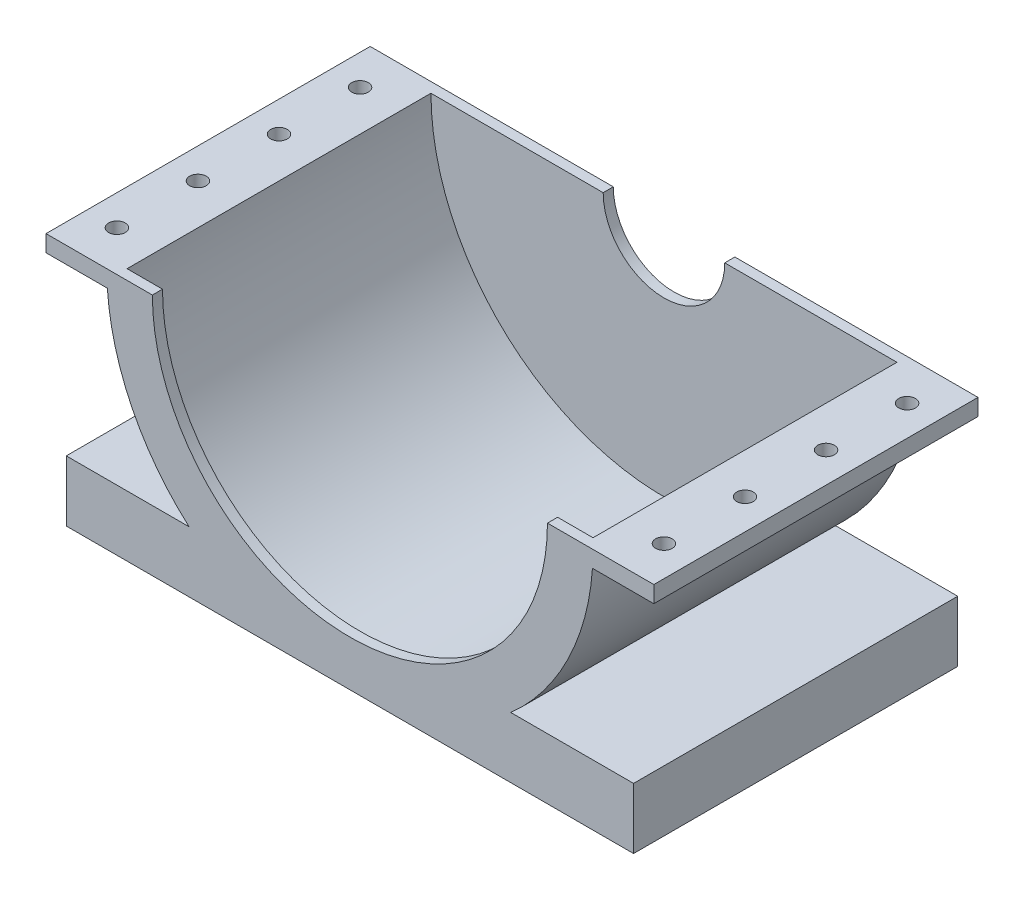
ISO-10303-21;
HEADER;
FILE_DESCRIPTION(('STEP AP214'),'2;1');
FILE_NAME('part.step','',(''),(''),'','','');
FILE_SCHEMA(('AUTOMOTIVE_DESIGN { 1 0 10303 214 1 1 1 1 }'));
ENDSEC;
DATA;
#1=APPLICATION_CONTEXT('core data for automotive mechanical design processes');
#2=APPLICATION_PROTOCOL_DEFINITION('international standard','automotive_design',2000,#1);
#3=PRODUCT_CONTEXT('',#1,'mechanical');
#4=PRODUCT('Part','Part','',(#3));
#5=PRODUCT_RELATED_PRODUCT_CATEGORY('part','',(#4));
#6=PRODUCT_DEFINITION_FORMATION('','',#4);
#7=PRODUCT_DEFINITION_CONTEXT('part definition',#1,'design');
#8=PRODUCT_DEFINITION('design','',#6,#7);
#9=PRODUCT_DEFINITION_SHAPE('','',#8);
#10=(LENGTH_UNIT() NAMED_UNIT(*) SI_UNIT(.MILLI.,.METRE.));
#11=(NAMED_UNIT(*) PLANE_ANGLE_UNIT() SI_UNIT($,.RADIAN.));
#12=(NAMED_UNIT(*) SI_UNIT($,.STERADIAN.) SOLID_ANGLE_UNIT());
#13=UNCERTAINTY_MEASURE_WITH_UNIT(LENGTH_MEASURE(1.E-05),#10,'distance_accuracy_value','');
#14=(GEOMETRIC_REPRESENTATION_CONTEXT(3) GLOBAL_UNCERTAINTY_ASSIGNED_CONTEXT((#13)) GLOBAL_UNIT_ASSIGNED_CONTEXT((#10,
#11,#12)) REPRESENTATION_CONTEXT('',''));
#15=CARTESIAN_POINT('',(0.,0.,0.));
#16=DIRECTION('',(0.,0.,1.));
#17=DIRECTION('',(1.,0.,0.));
#18=AXIS2_PLACEMENT_3D('',#15,#16,#17);
#19=CARTESIAN_POINT('',(0.,60.,80.));
#20=DIRECTION('',(0.,0.,-1.));
#21=DIRECTION('',(-1.,0.,0.));
#22=AXIS2_PLACEMENT_3D('',#19,#20,#21);
#23=CYLINDRICAL_SURFACE('',#22,48.75);
#24=DIRECTION('',(0.,0.,-1.));
#25=VECTOR('',#24,1.);
#26=CARTESIAN_POINT('',(48.75,60.,80.));
#27=LINE('',#26,#25);
#28=CARTESIAN_POINT('',(48.75,60.,80.));
#29=VERTEX_POINT('',#28);
#30=CARTESIAN_POINT('',(48.75,60.,77.5));
#31=VERTEX_POINT('',#30);
#32=EDGE_CURVE('E203',#29,#31,#27,.T.);
#33=ORIENTED_EDGE('',*,*,#32,.T.);
#34=CARTESIAN_POINT('',(0.,60.,77.5));
#35=DIRECTION('',(0.,0.,-1.));
#36=DIRECTION('',(-1.,0.,0.));
#37=AXIS2_PLACEMENT_3D('',#34,#35,#36);
#38=CIRCLE('',#37,48.75);
#39=CARTESIAN_POINT('',(-48.75,60.,77.5));
#40=VERTEX_POINT('',#39);
#41=EDGE_CURVE('E260',#31,#40,#38,.T.);
#42=ORIENTED_EDGE('',*,*,#41,.T.);
#43=DIRECTION('',(0.,0.,-1.));
#44=VECTOR('',#43,1.);
#45=CARTESIAN_POINT('',(-48.75,60.,80.));
#46=LINE('',#45,#44);
#47=CARTESIAN_POINT('',(-48.75,60.,80.));
#48=VERTEX_POINT('',#47);
#49=EDGE_CURVE('E200',#48,#40,#46,.T.);
#50=ORIENTED_EDGE('',*,*,#49,.F.);
#51=CARTESIAN_POINT('',(0.,60.,80.));
#52=DIRECTION('',(0.,0.,-1.));
#53=DIRECTION('',(1.,0.,0.));
#54=AXIS2_PLACEMENT_3D('',#51,#52,#53);
#55=CIRCLE('',#54,48.75);
#56=EDGE_CURVE('E297',#29,#48,#55,.T.);
#57=ORIENTED_EDGE('',*,*,#56,.F.);
#58=EDGE_LOOP('',(#33,#42,#50,#57));
#59=FACE_BOUND('',#58,.T.);
#60=ADVANCED_FACE('F35',(#59),#23,.F.);
#61=CARTESIAN_POINT('',(-70.,0.,80.));
#62=DIRECTION('',(1.,0.,0.));
#63=DIRECTION('',(0.,0.,-1.));
#64=AXIS2_PLACEMENT_3D('',#61,#62,#63);
#65=PLANE('',#64);
#66=DIRECTION('',(0.,-1.,0.));
#67=VECTOR('',#66,1.);
#68=CARTESIAN_POINT('',(-70.,0.,0.));
#69=LINE('',#68,#67);
#70=CARTESIAN_POINT('',(-70.,15.,0.));
#71=VERTEX_POINT('',#70);
#72=CARTESIAN_POINT('',(-70.,0.,0.));
#73=VERTEX_POINT('',#72);
#74=EDGE_CURVE('E167',#71,#73,#69,.T.);
#75=ORIENTED_EDGE('',*,*,#74,.T.);
#76=DIRECTION('',(0.,0.,-1.));
#77=VECTOR('',#76,1.);
#78=CARTESIAN_POINT('',(-70.,0.,80.));
#79=LINE('',#78,#77);
#80=CARTESIAN_POINT('',(-70.,0.,80.));
#81=VERTEX_POINT('',#80);
#82=EDGE_CURVE('E224',#81,#73,#79,.T.);
#83=ORIENTED_EDGE('',*,*,#82,.F.);
#84=DIRECTION('',(0.,-1.,0.));
#85=VECTOR('',#84,1.);
#86=CARTESIAN_POINT('',(-70.,0.,80.));
#87=LINE('',#86,#85);
#88=CARTESIAN_POINT('',(-70.,15.,80.));
#89=VERTEX_POINT('',#88);
#90=EDGE_CURVE('E193',#89,#81,#87,.T.);
#91=ORIENTED_EDGE('',*,*,#90,.F.);
#92=DIRECTION('',(0.,0.,-1.));
#93=VECTOR('',#92,1.);
#94=CARTESIAN_POINT('',(-70.,15.,80.));
#95=LINE('',#94,#93);
#96=EDGE_CURVE('E163',#89,#71,#95,.T.);
#97=ORIENTED_EDGE('',*,*,#96,.T.);
#98=EDGE_LOOP('',(#75,#83,#91,#97));
#99=FACE_BOUND('',#98,.T.);
#100=ADVANCED_FACE('F37',(#99),#65,.F.);
#101=CARTESIAN_POINT('',(-70.,0.,80.));
#102=DIRECTION('',(0.,1.,0.));
#103=DIRECTION('',(0.,0.,1.));
#104=AXIS2_PLACEMENT_3D('',#101,#102,#103);
#105=PLANE('',#104);
#106=DIRECTION('',(1.,0.,0.));
#107=VECTOR('',#106,1.);
#108=CARTESIAN_POINT('',(-70.,0.,0.));
#109=LINE('',#108,#107);
#110=CARTESIAN_POINT('',(70.,0.,0.));
#111=VERTEX_POINT('',#110);
#112=EDGE_CURVE('E170',#73,#111,#109,.T.);
#113=ORIENTED_EDGE('',*,*,#112,.T.);
#114=DIRECTION('',(0.,0.,-1.));
#115=VECTOR('',#114,1.);
#116=CARTESIAN_POINT('',(70.,0.,80.));
#117=LINE('',#116,#115);
#118=CARTESIAN_POINT('',(70.,0.,80.));
#119=VERTEX_POINT('',#118);
#120=EDGE_CURVE('E221',#119,#111,#117,.T.);
#121=ORIENTED_EDGE('',*,*,#120,.F.);
#122=DIRECTION('',(1.,0.,0.));
#123=VECTOR('',#122,1.);
#124=CARTESIAN_POINT('',(-70.,0.,80.));
#125=LINE('',#124,#123);
#126=EDGE_CURVE('E109',#81,#119,#125,.T.);
#127=ORIENTED_EDGE('',*,*,#126,.F.);
#128=ORIENTED_EDGE('',*,*,#82,.T.);
#129=EDGE_LOOP('',(#113,#121,#127,#128));
#130=FACE_BOUND('',#129,.T.);
#131=ADVANCED_FACE('F331',(#130),#105,.F.);
#132=CARTESIAN_POINT('',(70.,0.,80.));
#133=DIRECTION('',(-1.,0.,0.));
#134=DIRECTION('',(0.,0.,1.));
#135=AXIS2_PLACEMENT_3D('',#132,#133,#134);
#136=PLANE('',#135);
#137=DIRECTION('',(0.,1.,0.));
#138=VECTOR('',#137,1.);
#139=CARTESIAN_POINT('',(70.,0.,0.));
#140=LINE('',#139,#138);
#141=CARTESIAN_POINT('',(70.,15.,0.));
#142=VERTEX_POINT('',#141);
#143=EDGE_CURVE('E173',#111,#142,#140,.T.);
#144=ORIENTED_EDGE('',*,*,#143,.T.);
#145=DIRECTION('',(0.,0.,-1.));
#146=VECTOR('',#145,1.);
#147=CARTESIAN_POINT('',(70.,15.,80.));
#148=LINE('',#147,#146);
#149=CARTESIAN_POINT('',(70.,15.,80.));
#150=VERTEX_POINT('',#149);
#151=EDGE_CURVE('E218',#150,#142,#148,.T.);
#152=ORIENTED_EDGE('',*,*,#151,.F.);
#153=DIRECTION('',(0.,1.,0.));
#154=VECTOR('',#153,1.);
#155=CARTESIAN_POINT('',(70.,0.,80.));
#156=LINE('',#155,#154);
#157=EDGE_CURVE('E285',#119,#150,#156,.T.);
#158=ORIENTED_EDGE('',*,*,#157,.F.);
#159=ORIENTED_EDGE('',*,*,#120,.T.);
#160=EDGE_LOOP('',(#144,#152,#158,#159));
#161=FACE_BOUND('',#160,.T.);
#162=ADVANCED_FACE('F354',(#161),#136,.F.);
#163=CARTESIAN_POINT('',(39.6862696659689,15.,80.));
#164=DIRECTION('',(0.,-1.,0.));
#165=DIRECTION('',(0.,0.,-1.));
#166=AXIS2_PLACEMENT_3D('',#163,#164,#165);
#167=PLANE('',#166);
#168=DIRECTION('',(-1.,0.,0.));
#169=VECTOR('',#168,1.);
#170=CARTESIAN_POINT('',(39.6862696659689,15.,0.));
#171=LINE('',#170,#169);
#172=CARTESIAN_POINT('',(39.6862696659689,15.,0.));
#173=VERTEX_POINT('',#172);
#174=EDGE_CURVE('E175',#142,#173,#171,.T.);
#175=ORIENTED_EDGE('',*,*,#174,.T.);
#176=DIRECTION('',(0.,0.,-1.));
#177=VECTOR('',#176,1.);
#178=CARTESIAN_POINT('',(39.6862696659689,15.,80.));
#179=LINE('',#178,#177);
#180=CARTESIAN_POINT('',(39.6862696659689,15.,80.));
#181=VERTEX_POINT('',#180);
#182=EDGE_CURVE('E215',#181,#173,#179,.T.);
#183=ORIENTED_EDGE('',*,*,#182,.F.);
#184=DIRECTION('',(-1.,0.,0.));
#185=VECTOR('',#184,1.);
#186=CARTESIAN_POINT('',(39.6862696659689,15.,80.));
#187=LINE('',#186,#185);
#188=EDGE_CURVE('E287',#150,#181,#187,.T.);
#189=ORIENTED_EDGE('',*,*,#188,.F.);
#190=ORIENTED_EDGE('',*,*,#151,.T.);
#191=EDGE_LOOP('',(#175,#183,#189,#190));
#192=FACE_BOUND('',#191,.T.);
#193=ADVANCED_FACE('F350',(#192),#167,.F.);
#194=CARTESIAN_POINT('',(0.,60.,80.));
#195=DIRECTION('',(0.,0.,-1.));
#196=DIRECTION('',(-1.,0.,0.));
#197=AXIS2_PLACEMENT_3D('',#194,#195,#196);
#198=CYLINDRICAL_SURFACE('',#197,60.);
#199=CARTESIAN_POINT('',(0.,60.,0.));
#200=DIRECTION('',(0.,0.,1.));
#201=DIRECTION('',(1.,0.,0.));
#202=AXIS2_PLACEMENT_3D('',#199,#200,#201);
#203=CIRCLE('',#202,60.);
#204=CARTESIAN_POINT('',(59.8597527559211,55.9,0.));
#205=VERTEX_POINT('',#204);
#206=EDGE_CURVE('E177',#173,#205,#203,.T.);
#207=ORIENTED_EDGE('',*,*,#206,.T.);
#208=DIRECTION('',(0.,0.,-1.));
#209=VECTOR('',#208,1.);
#210=CARTESIAN_POINT('',(59.8597527559211,55.9,80.));
#211=LINE('',#210,#209);
#212=CARTESIAN_POINT('',(59.8597527559211,55.9,80.));
#213=VERTEX_POINT('',#212);
#214=EDGE_CURVE('E212',#213,#205,#211,.T.);
#215=ORIENTED_EDGE('',*,*,#214,.F.);
#216=CARTESIAN_POINT('',(0.,60.,80.));
#217=DIRECTION('',(0.,0.,1.));
#218=DIRECTION('',(1.,0.,0.));
#219=AXIS2_PLACEMENT_3D('',#216,#217,#218);
#220=CIRCLE('',#219,60.);
#221=EDGE_CURVE('E289',#181,#213,#220,.T.);
#222=ORIENTED_EDGE('',*,*,#221,.F.);
#223=ORIENTED_EDGE('',*,*,#182,.T.);
#224=EDGE_LOOP('',(#207,#215,#222,#223));
#225=FACE_BOUND('',#224,.T.);
#226=ADVANCED_FACE('F346',(#225),#198,.T.);
#227=CARTESIAN_POINT('',(75.,55.9,80.));
#228=DIRECTION('',(0.,1.,0.));
#229=DIRECTION('',(-1.,0.,0.));
#230=AXIS2_PLACEMENT_3D('',#227,#228,#229);
#231=PLANE('',#230);
#232=CARTESIAN_POINT('',(67.5,55.8999999999999,50.));
#233=DIRECTION('',(0.,1.,0.));
#234=DIRECTION('',(-1.,0.,0.));
#235=AXIS2_PLACEMENT_3D('',#232,#233,#234);
#236=CIRCLE('',#235,2.04999999999999);
#237=CARTESIAN_POINT('',(65.45,55.8999999999999,50.));
#238=VERTEX_POINT('',#237);
#239=EDGE_CURVE('E561',#238,#238,#236,.F.);
#240=ORIENTED_EDGE('',*,*,#239,.F.);
#241=EDGE_LOOP('',(#240));
#242=FACE_BOUND('',#241,.T.);
#243=CARTESIAN_POINT('',(67.5,55.8999999999999,30.));
#244=DIRECTION('',(0.,1.,0.));
#245=DIRECTION('',(-1.,0.,0.));
#246=AXIS2_PLACEMENT_3D('',#243,#244,#245);
#247=CIRCLE('',#246,2.04999999999999);
#248=CARTESIAN_POINT('',(65.45,55.8999999999999,30.));
#249=VERTEX_POINT('',#248);
#250=EDGE_CURVE('E565',#249,#249,#247,.F.);
#251=ORIENTED_EDGE('',*,*,#250,.F.);
#252=EDGE_LOOP('',(#251));
#253=FACE_BOUND('',#252,.T.);
#254=CARTESIAN_POINT('',(67.5,55.8999999999999,10.));
#255=DIRECTION('',(0.,1.,0.));
#256=DIRECTION('',(-1.,0.,0.));
#257=AXIS2_PLACEMENT_3D('',#254,#255,#256);
#258=CIRCLE('',#257,2.04999999999999);
#259=CARTESIAN_POINT('',(65.45,55.8999999999999,10.));
#260=VERTEX_POINT('',#259);
#261=EDGE_CURVE('E577',#260,#260,#258,.F.);
#262=ORIENTED_EDGE('',*,*,#261,.F.);
#263=EDGE_LOOP('',(#262));
#264=FACE_BOUND('',#263,.T.);
#265=CARTESIAN_POINT('',(67.5,55.8999999999999,70.));
#266=DIRECTION('',(0.,1.,0.));
#267=DIRECTION('',(-1.,0.,0.));
#268=AXIS2_PLACEMENT_3D('',#265,#266,#267);
#269=CIRCLE('',#268,2.04999999999999);
#270=CARTESIAN_POINT('',(65.45,55.8999999999999,70.));
#271=VERTEX_POINT('',#270);
#272=EDGE_CURVE('E264',#271,#271,#269,.F.);
#273=ORIENTED_EDGE('',*,*,#272,.F.);
#274=EDGE_LOOP('',(#273));
#275=FACE_BOUND('',#274,.T.);
#276=DIRECTION('',(1.,0.,0.));
#277=VECTOR('',#276,1.);
#278=CARTESIAN_POINT('',(75.,55.9,0.));
#279=LINE('',#278,#277);
#280=CARTESIAN_POINT('',(75.,55.9,0.));
#281=VERTEX_POINT('',#280);
#282=EDGE_CURVE('E179',#205,#281,#279,.T.);
#283=ORIENTED_EDGE('',*,*,#282,.T.);
#284=DIRECTION('',(0.,0.,-1.));
#285=VECTOR('',#284,1.);
#286=CARTESIAN_POINT('',(75.,55.9,80.));
#287=LINE('',#286,#285);
#288=CARTESIAN_POINT('',(75.,55.9,80.));
#289=VERTEX_POINT('',#288);
#290=EDGE_CURVE('E209',#289,#281,#287,.T.);
#291=ORIENTED_EDGE('',*,*,#290,.F.);
#292=DIRECTION('',(1.,0.,0.));
#293=VECTOR('',#292,1.);
#294=CARTESIAN_POINT('',(75.,55.9,80.));
#295=LINE('',#294,#293);
#296=EDGE_CURVE('E291',#213,#289,#295,.T.);
#297=ORIENTED_EDGE('',*,*,#296,.F.);
#298=ORIENTED_EDGE('',*,*,#214,.T.);
#299=EDGE_LOOP('',(#283,#291,#297,#298));
#300=FACE_BOUND('',#299,.T.);
#301=ADVANCED_FACE('F342',(#242,#253,#264,#275,#300),#231,.F.);
#302=CARTESIAN_POINT('',(75.,60.,80.));
#303=DIRECTION('',(-1.,0.,0.));
#304=DIRECTION('',(0.,0.,1.));
#305=AXIS2_PLACEMENT_3D('',#302,#303,#304);
#306=PLANE('',#305);
#307=DIRECTION('',(0.,1.,0.));
#308=VECTOR('',#307,1.);
#309=CARTESIAN_POINT('',(75.,60.,0.));
#310=LINE('',#309,#308);
#311=CARTESIAN_POINT('',(75.,60.,0.));
#312=VERTEX_POINT('',#311);
#313=EDGE_CURVE('E181',#281,#312,#310,.T.);
#314=ORIENTED_EDGE('',*,*,#313,.T.);
#315=DIRECTION('',(0.,0.,-1.));
#316=VECTOR('',#315,1.);
#317=CARTESIAN_POINT('',(75.,60.,80.));
#318=LINE('',#317,#316);
#319=CARTESIAN_POINT('',(75.,60.,80.));
#320=VERTEX_POINT('',#319);
#321=EDGE_CURVE('E206',#320,#312,#318,.T.);
#322=ORIENTED_EDGE('',*,*,#321,.F.);
#323=DIRECTION('',(0.,1.,0.));
#324=VECTOR('',#323,1.);
#325=CARTESIAN_POINT('',(75.,60.,80.));
#326=LINE('',#325,#324);
#327=EDGE_CURVE('E293',#289,#320,#326,.T.);
#328=ORIENTED_EDGE('',*,*,#327,.F.);
#329=ORIENTED_EDGE('',*,*,#290,.T.);
#330=EDGE_LOOP('',(#314,#322,#328,#329));
#331=FACE_BOUND('',#330,.T.);
#332=ADVANCED_FACE('F338',(#331),#306,.F.);
#333=CARTESIAN_POINT('',(48.75,60.,80.));
#334=DIRECTION('',(0.,-1.,0.));
#335=DIRECTION('',(0.,0.,-1.));
#336=AXIS2_PLACEMENT_3D('',#333,#334,#335);
#337=PLANE('',#336);
#338=CARTESIAN_POINT('',(67.5,60.,50.));
#339=DIRECTION('',(0.,1.,0.));
#340=DIRECTION('',(0.,0.,1.));
#341=AXIS2_PLACEMENT_3D('',#338,#339,#340);
#342=CIRCLE('',#341,2.04999999999999);
#343=CARTESIAN_POINT('',(67.5,60.,52.05));
#344=VERTEX_POINT('',#343);
#345=EDGE_CURVE('E564',#344,#344,#342,.T.);
#346=ORIENTED_EDGE('',*,*,#345,.F.);
#347=EDGE_LOOP('',(#346));
#348=FACE_BOUND('',#347,.T.);
#349=CARTESIAN_POINT('',(67.5,60.,30.));
#350=DIRECTION('',(0.,1.,0.));
#351=DIRECTION('',(0.,0.,1.));
#352=AXIS2_PLACEMENT_3D('',#349,#350,#351);
#353=CIRCLE('',#352,2.04999999999999);
#354=CARTESIAN_POINT('',(67.5,60.,32.05));
#355=VERTEX_POINT('',#354);
#356=EDGE_CURVE('E570',#355,#355,#353,.T.);
#357=ORIENTED_EDGE('',*,*,#356,.F.);
#358=EDGE_LOOP('',(#357));
#359=FACE_BOUND('',#358,.T.);
#360=CARTESIAN_POINT('',(67.5,60.,10.));
#361=DIRECTION('',(0.,1.,0.));
#362=DIRECTION('',(0.,0.,1.));
#363=AXIS2_PLACEMENT_3D('',#360,#361,#362);
#364=CIRCLE('',#363,2.04999999999999);
#365=CARTESIAN_POINT('',(67.5,60.,12.05));
#366=VERTEX_POINT('',#365);
#367=EDGE_CURVE('E579',#366,#366,#364,.T.);
#368=ORIENTED_EDGE('',*,*,#367,.F.);
#369=EDGE_LOOP('',(#368));
#370=FACE_BOUND('',#369,.T.);
#371=CARTESIAN_POINT('',(67.5,60.,70.));
#372=DIRECTION('',(0.,1.,0.));
#373=DIRECTION('',(0.,0.,1.));
#374=AXIS2_PLACEMENT_3D('',#371,#372,#373);
#375=CIRCLE('',#374,2.04999999999999);
#376=CARTESIAN_POINT('',(67.5,60.,72.05));
#377=VERTEX_POINT('',#376);
#378=EDGE_CURVE('E567',#377,#377,#375,.T.);
#379=ORIENTED_EDGE('',*,*,#378,.F.);
#380=EDGE_LOOP('',(#379));
#381=FACE_BOUND('',#380,.T.);
#382=DIRECTION('',(0.,0.,-1.));
#383=VECTOR('',#382,1.);
#384=CARTESIAN_POINT('',(57.5,60.,0.));
#385=LINE('',#384,#383);
#386=CARTESIAN_POINT('',(57.5,60.,2.5));
#387=VERTEX_POINT('',#386);
#388=CARTESIAN_POINT('',(57.5,60.,77.5));
#389=VERTEX_POINT('',#388);
#390=EDGE_CURVE('E262',#387,#389,#385,.F.);
#391=ORIENTED_EDGE('',*,*,#390,.T.);
#392=DIRECTION('',(-1.,0.,0.));
#393=VECTOR('',#392,1.);
#394=CARTESIAN_POINT('',(48.75,60.,77.5));
#395=LINE('',#394,#393);
#396=EDGE_CURVE('E259',#389,#31,#395,.T.);
#397=ORIENTED_EDGE('',*,*,#396,.T.);
#398=ORIENTED_EDGE('',*,*,#32,.F.);
#399=DIRECTION('',(-1.,0.,0.));
#400=VECTOR('',#399,1.);
#401=CARTESIAN_POINT('',(48.75,60.,80.));
#402=LINE('',#401,#400);
#403=EDGE_CURVE('E295',#320,#29,#402,.T.);
#404=ORIENTED_EDGE('',*,*,#403,.F.);
#405=ORIENTED_EDGE('',*,*,#321,.T.);
#406=DIRECTION('',(-1.,0.,0.));
#407=VECTOR('',#406,1.);
#408=CARTESIAN_POINT('',(48.75,60.,0.));
#409=LINE('',#408,#407);
#410=CARTESIAN_POINT('',(15.,60.,0.));
#411=VERTEX_POINT('',#410);
#412=EDGE_CURVE('E183',#312,#411,#409,.T.);
#413=ORIENTED_EDGE('',*,*,#412,.T.);
#414=DIRECTION('',(0.,0.,-1.));
#415=VECTOR('',#414,1.);
#416=CARTESIAN_POINT('',(15.,60.,2.5));
#417=LINE('',#416,#415);
#418=CARTESIAN_POINT('',(15.,60.,2.5));
#419=VERTEX_POINT('',#418);
#420=EDGE_CURVE('E277',#419,#411,#417,.T.);
#421=ORIENTED_EDGE('',*,*,#420,.F.);
#422=DIRECTION('',(-1.,0.,0.));
#423=VECTOR('',#422,1.);
#424=CARTESIAN_POINT('',(0.,60.,2.5));
#425=LINE('',#424,#423);
#426=EDGE_CURVE('E273',#387,#419,#425,.T.);
#427=ORIENTED_EDGE('',*,*,#426,.F.);
#428=EDGE_LOOP('',(#391,#397,#398,#404,#405,#413,#421,#427));
#429=FACE_BOUND('',#428,.T.);
#430=ADVANCED_FACE('F335',(#348,#359,#370,#381,#429),#337,.F.);
#431=CARTESIAN_POINT('',(-75.,60.,80.));
#432=DIRECTION('',(0.,-1.,0.));
#433=DIRECTION('',(0.,0.,-1.));
#434=AXIS2_PLACEMENT_3D('',#431,#432,#433);
#435=PLANE('',#434);
#436=CARTESIAN_POINT('',(-67.5,60.,10.));
#437=DIRECTION('',(0.,1.,0.));
#438=DIRECTION('',(0.,0.,-1.));
#439=AXIS2_PLACEMENT_3D('',#436,#437,#438);
#440=CIRCLE('',#439,2.04999999999999);
#441=CARTESIAN_POINT('',(-67.5,60.,7.95000000000002));
#442=VERTEX_POINT('',#441);
#443=EDGE_CURVE('E585',#442,#442,#440,.T.);
#444=ORIENTED_EDGE('',*,*,#443,.F.);
#445=EDGE_LOOP('',(#444));
#446=FACE_BOUND('',#445,.T.);
#447=CARTESIAN_POINT('',(-67.5,60.,30.));
#448=DIRECTION('',(0.,1.,0.));
#449=DIRECTION('',(0.,0.,-1.));
#450=AXIS2_PLACEMENT_3D('',#447,#448,#449);
#451=CIRCLE('',#450,2.04999999999999);
#452=CARTESIAN_POINT('',(-67.5,60.,27.95));
#453=VERTEX_POINT('',#452);
#454=EDGE_CURVE('E618',#453,#453,#451,.T.);
#455=ORIENTED_EDGE('',*,*,#454,.F.);
#456=EDGE_LOOP('',(#455));
#457=FACE_BOUND('',#456,.T.);
#458=CARTESIAN_POINT('',(-67.5,60.,50.));
#459=DIRECTION('',(0.,1.,0.));
#460=DIRECTION('',(0.,0.,-1.));
#461=AXIS2_PLACEMENT_3D('',#458,#459,#460);
#462=CIRCLE('',#461,2.04999999999999);
#463=CARTESIAN_POINT('',(-67.5,60.,47.95));
#464=VERTEX_POINT('',#463);
#465=EDGE_CURVE('E610',#464,#464,#462,.T.);
#466=ORIENTED_EDGE('',*,*,#465,.F.);
#467=EDGE_LOOP('',(#466));
#468=FACE_BOUND('',#467,.T.);
#469=CARTESIAN_POINT('',(-67.5,60.,70.));
#470=DIRECTION('',(0.,1.,0.));
#471=DIRECTION('',(0.,0.,-1.));
#472=AXIS2_PLACEMENT_3D('',#469,#470,#471);
#473=CIRCLE('',#472,2.04999999999999);
#474=CARTESIAN_POINT('',(-67.5,60.,67.95));
#475=VERTEX_POINT('',#474);
#476=EDGE_CURVE('E611',#475,#475,#473,.T.);
#477=ORIENTED_EDGE('',*,*,#476,.F.);
#478=EDGE_LOOP('',(#477));
#479=FACE_BOUND('',#478,.T.);
#480=ORIENTED_EDGE('',*,*,#49,.T.);
#481=DIRECTION('',(-1.,0.,0.));
#482=VECTOR('',#481,1.);
#483=CARTESIAN_POINT('',(-75.,60.,77.5));
#484=LINE('',#483,#482);
#485=CARTESIAN_POINT('',(-57.5,60.,77.5));
#486=VERTEX_POINT('',#485);
#487=EDGE_CURVE('E11',#40,#486,#484,.T.);
#488=ORIENTED_EDGE('',*,*,#487,.T.);
#489=DIRECTION('',(0.,0.,-1.));
#490=VECTOR('',#489,1.);
#491=CARTESIAN_POINT('',(-57.5,60.,0.));
#492=LINE('',#491,#490);
#493=CARTESIAN_POINT('',(-57.5,60.,2.5));
#494=VERTEX_POINT('',#493);
#495=EDGE_CURVE('E44',#486,#494,#492,.T.);
#496=ORIENTED_EDGE('',*,*,#495,.T.);
#497=DIRECTION('',(-1.,0.,0.));
#498=VECTOR('',#497,1.);
#499=CARTESIAN_POINT('',(0.,60.,2.5));
#500=LINE('',#499,#498);
#501=CARTESIAN_POINT('',(-15.,60.,2.5));
#502=VERTEX_POINT('',#501);
#503=EDGE_CURVE('E233',#502,#494,#500,.T.);
#504=ORIENTED_EDGE('',*,*,#503,.F.);
#505=DIRECTION('',(0.,0.,-1.));
#506=VECTOR('',#505,1.);
#507=CARTESIAN_POINT('',(-15.,60.,2.5));
#508=LINE('',#507,#506);
#509=CARTESIAN_POINT('',(-15.,60.,0.));
#510=VERTEX_POINT('',#509);
#511=EDGE_CURVE('E171',#502,#510,#508,.T.);
#512=ORIENTED_EDGE('',*,*,#511,.T.);
#513=DIRECTION('',(-1.,0.,0.));
#514=VECTOR('',#513,1.);
#515=CARTESIAN_POINT('',(-75.,60.,0.));
#516=LINE('',#515,#514);
#517=CARTESIAN_POINT('',(-75.,60.,0.));
#518=VERTEX_POINT('',#517);
#519=EDGE_CURVE('E186',#510,#518,#516,.T.);
#520=ORIENTED_EDGE('',*,*,#519,.T.);
#521=DIRECTION('',(0.,0.,-1.));
#522=VECTOR('',#521,1.);
#523=CARTESIAN_POINT('',(-75.,60.,80.));
#524=LINE('',#523,#522);
#525=CARTESIAN_POINT('',(-75.,60.,80.));
#526=VERTEX_POINT('',#525);
#527=EDGE_CURVE('E197',#526,#518,#524,.T.);
#528=ORIENTED_EDGE('',*,*,#527,.F.);
#529=DIRECTION('',(-1.,0.,0.));
#530=VECTOR('',#529,1.);
#531=CARTESIAN_POINT('',(-75.,60.,80.));
#532=LINE('',#531,#530);
#533=EDGE_CURVE('E299',#48,#526,#532,.T.);
#534=ORIENTED_EDGE('',*,*,#533,.F.);
#535=EDGE_LOOP('',(#480,#488,#496,#504,#512,#520,#528,#534));
#536=FACE_BOUND('',#535,.T.);
#537=ADVANCED_FACE('F230',(#446,#457,#468,#479,#536),#435,.F.);
#538=CARTESIAN_POINT('',(-75.,55.9,80.));
#539=DIRECTION('',(1.,0.,0.));
#540=DIRECTION('',(0.,0.,-1.));
#541=AXIS2_PLACEMENT_3D('',#538,#539,#540);
#542=PLANE('',#541);
#543=DIRECTION('',(0.,-1.,0.));
#544=VECTOR('',#543,1.);
#545=CARTESIAN_POINT('',(-75.,55.9,0.));
#546=LINE('',#545,#544);
#547=CARTESIAN_POINT('',(-75.,55.9,0.));
#548=VERTEX_POINT('',#547);
#549=EDGE_CURVE('E188',#518,#548,#546,.T.);
#550=ORIENTED_EDGE('',*,*,#549,.T.);
#551=DIRECTION('',(0.,0.,-1.));
#552=VECTOR('',#551,1.);
#553=CARTESIAN_POINT('',(-75.,55.9,80.));
#554=LINE('',#553,#552);
#555=CARTESIAN_POINT('',(-75.,55.9,80.));
#556=VERTEX_POINT('',#555);
#557=EDGE_CURVE('E158',#556,#548,#554,.T.);
#558=ORIENTED_EDGE('',*,*,#557,.F.);
#559=DIRECTION('',(0.,-1.,0.));
#560=VECTOR('',#559,1.);
#561=CARTESIAN_POINT('',(-75.,55.9,80.));
#562=LINE('',#561,#560);
#563=EDGE_CURVE('E149',#526,#556,#562,.T.);
#564=ORIENTED_EDGE('',*,*,#563,.F.);
#565=ORIENTED_EDGE('',*,*,#527,.T.);
#566=EDGE_LOOP('',(#550,#558,#564,#565));
#567=FACE_BOUND('',#566,.T.);
#568=ADVANCED_FACE('F307',(#567),#542,.F.);
#569=CARTESIAN_POINT('',(-59.8597527559211,55.9,80.));
#570=DIRECTION('',(0.,1.,0.));
#571=DIRECTION('',(-1.,0.,0.));
#572=AXIS2_PLACEMENT_3D('',#569,#570,#571);
#573=PLANE('',#572);
#574=CARTESIAN_POINT('',(-67.5,55.9,10.));
#575=DIRECTION('',(0.,1.,0.));
#576=DIRECTION('',(-1.,0.,0.));
#577=AXIS2_PLACEMENT_3D('',#574,#575,#576);
#578=CIRCLE('',#577,2.04999999999999);
#579=CARTESIAN_POINT('',(-69.55,55.9,10.));
#580=VERTEX_POINT('',#579);
#581=EDGE_CURVE('E582',#580,#580,#578,.F.);
#582=ORIENTED_EDGE('',*,*,#581,.F.);
#583=EDGE_LOOP('',(#582));
#584=FACE_BOUND('',#583,.T.);
#585=CARTESIAN_POINT('',(-67.5,55.9,30.));
#586=DIRECTION('',(0.,1.,0.));
#587=DIRECTION('',(-1.,0.,0.));
#588=AXIS2_PLACEMENT_3D('',#585,#586,#587);
#589=CIRCLE('',#588,2.04999999999999);
#590=CARTESIAN_POINT('',(-69.55,55.9,30.));
#591=VERTEX_POINT('',#590);
#592=EDGE_CURVE('E588',#591,#591,#589,.F.);
#593=ORIENTED_EDGE('',*,*,#592,.F.);
#594=EDGE_LOOP('',(#593));
#595=FACE_BOUND('',#594,.T.);
#596=CARTESIAN_POINT('',(-67.5,55.9,50.));
#597=DIRECTION('',(0.,1.,0.));
#598=DIRECTION('',(-1.,0.,0.));
#599=AXIS2_PLACEMENT_3D('',#596,#597,#598);
#600=CIRCLE('',#599,2.04999999999999);
#601=CARTESIAN_POINT('',(-69.55,55.9,50.));
#602=VERTEX_POINT('',#601);
#603=EDGE_CURVE('E607',#602,#602,#600,.F.);
#604=ORIENTED_EDGE('',*,*,#603,.F.);
#605=EDGE_LOOP('',(#604));
#606=FACE_BOUND('',#605,.T.);
#607=CARTESIAN_POINT('',(-67.5,55.9,70.));
#608=DIRECTION('',(0.,1.,0.));
#609=DIRECTION('',(-1.,0.,0.));
#610=AXIS2_PLACEMENT_3D('',#607,#608,#609);
#611=CIRCLE('',#610,2.04999999999999);
#612=CARTESIAN_POINT('',(-69.55,55.9,70.));
#613=VERTEX_POINT('',#612);
#614=EDGE_CURVE('E573',#613,#613,#611,.F.);
#615=ORIENTED_EDGE('',*,*,#614,.F.);
#616=EDGE_LOOP('',(#615));
#617=FACE_BOUND('',#616,.T.);
#618=DIRECTION('',(1.,0.,0.));
#619=VECTOR('',#618,1.);
#620=CARTESIAN_POINT('',(-59.8597527559211,55.9,0.));
#621=LINE('',#620,#619);
#622=CARTESIAN_POINT('',(-59.8597527559211,55.9,0.));
#623=VERTEX_POINT('',#622);
#624=EDGE_CURVE('E157',#548,#623,#621,.T.);
#625=ORIENTED_EDGE('',*,*,#624,.T.);
#626=DIRECTION('',(0.,0.,-1.));
#627=VECTOR('',#626,1.);
#628=CARTESIAN_POINT('',(-59.8597527559211,55.9,80.));
#629=LINE('',#628,#627);
#630=CARTESIAN_POINT('',(-59.8597527559211,55.9,80.));
#631=VERTEX_POINT('',#630);
#632=EDGE_CURVE('E154',#631,#623,#629,.T.);
#633=ORIENTED_EDGE('',*,*,#632,.F.);
#634=DIRECTION('',(1.,0.,0.));
#635=VECTOR('',#634,1.);
#636=CARTESIAN_POINT('',(-59.8597527559211,55.9,80.));
#637=LINE('',#636,#635);
#638=EDGE_CURVE('E143',#556,#631,#637,.T.);
#639=ORIENTED_EDGE('',*,*,#638,.F.);
#640=ORIENTED_EDGE('',*,*,#557,.T.);
#641=EDGE_LOOP('',(#625,#633,#639,#640));
#642=FACE_BOUND('',#641,.T.);
#643=ADVANCED_FACE('F155',(#584,#595,#606,#617,#642),#573,.F.);
#644=CARTESIAN_POINT('',(0.,60.,80.));
#645=DIRECTION('',(0.,0.,-1.));
#646=DIRECTION('',(-1.,0.,0.));
#647=AXIS2_PLACEMENT_3D('',#644,#645,#646);
#648=CYLINDRICAL_SURFACE('',#647,60.);
#649=CARTESIAN_POINT('',(0.,60.,0.));
#650=DIRECTION('',(0.,0.,1.));
#651=DIRECTION('',(1.,0.,0.));
#652=AXIS2_PLACEMENT_3D('',#649,#650,#651);
#653=CIRCLE('',#652,60.);
#654=CARTESIAN_POINT('',(-39.6862696659689,15.,0.));
#655=VERTEX_POINT('',#654);
#656=EDGE_CURVE('E94',#623,#655,#653,.T.);
#657=ORIENTED_EDGE('',*,*,#656,.T.);
#658=DIRECTION('',(0.,0.,-1.));
#659=VECTOR('',#658,1.);
#660=CARTESIAN_POINT('',(-39.6862696659689,15.,80.));
#661=LINE('',#660,#659);
#662=CARTESIAN_POINT('',(-39.6862696659689,15.,80.));
#663=VERTEX_POINT('',#662);
#664=EDGE_CURVE('E159',#663,#655,#661,.T.);
#665=ORIENTED_EDGE('',*,*,#664,.F.);
#666=CARTESIAN_POINT('',(0.,60.,80.));
#667=DIRECTION('',(0.,0.,1.));
#668=DIRECTION('',(1.,0.,0.));
#669=AXIS2_PLACEMENT_3D('',#666,#667,#668);
#670=CIRCLE('',#669,60.);
#671=EDGE_CURVE('E147',#631,#663,#670,.T.);
#672=ORIENTED_EDGE('',*,*,#671,.F.);
#673=ORIENTED_EDGE('',*,*,#632,.T.);
#674=EDGE_LOOP('',(#657,#665,#672,#673));
#675=FACE_BOUND('',#674,.T.);
#676=ADVANCED_FACE('F161',(#675),#648,.T.);
#677=CARTESIAN_POINT('',(-70.,15.,80.));
#678=DIRECTION('',(0.,-1.,0.));
#679=DIRECTION('',(0.,0.,-1.));
#680=AXIS2_PLACEMENT_3D('',#677,#678,#679);
#681=PLANE('',#680);
#682=DIRECTION('',(-1.,0.,0.));
#683=VECTOR('',#682,1.);
#684=CARTESIAN_POINT('',(-70.,15.,0.));
#685=LINE('',#684,#683);
#686=EDGE_CURVE('E100',#655,#71,#685,.T.);
#687=ORIENTED_EDGE('',*,*,#686,.T.);
#688=ORIENTED_EDGE('',*,*,#96,.F.);
#689=DIRECTION('',(-1.,0.,0.));
#690=VECTOR('',#689,1.);
#691=CARTESIAN_POINT('',(-70.,15.,80.));
#692=LINE('',#691,#690);
#693=EDGE_CURVE('E52',#663,#89,#692,.T.);
#694=ORIENTED_EDGE('',*,*,#693,.F.);
#695=ORIENTED_EDGE('',*,*,#664,.T.);
#696=EDGE_LOOP('',(#687,#688,#694,#695));
#697=FACE_BOUND('',#696,.T.);
#698=ADVANCED_FACE('F315',(#697),#681,.F.);
#699=CARTESIAN_POINT('',(0.,60.,80.));
#700=DIRECTION('',(0.,0.,1.));
#701=DIRECTION('',(1.,0.,0.));
#702=AXIS2_PLACEMENT_3D('',#699,#700,#701);
#703=PLANE('',#702);
#704=ORIENTED_EDGE('',*,*,#90,.T.);
#705=ORIENTED_EDGE('',*,*,#126,.T.);
#706=ORIENTED_EDGE('',*,*,#157,.T.);
#707=ORIENTED_EDGE('',*,*,#188,.T.);
#708=ORIENTED_EDGE('',*,*,#221,.T.);
#709=ORIENTED_EDGE('',*,*,#296,.T.);
#710=ORIENTED_EDGE('',*,*,#327,.T.);
#711=ORIENTED_EDGE('',*,*,#403,.T.);
#712=ORIENTED_EDGE('',*,*,#56,.T.);
#713=ORIENTED_EDGE('',*,*,#533,.T.);
#714=ORIENTED_EDGE('',*,*,#563,.T.);
#715=ORIENTED_EDGE('',*,*,#638,.T.);
#716=ORIENTED_EDGE('',*,*,#671,.T.);
#717=ORIENTED_EDGE('',*,*,#693,.T.);
#718=EDGE_LOOP('',(#704,#705,#706,#707,#708,#709,#710,#711,#712,#713,#714,#715,#716,#717));
#719=FACE_BOUND('',#718,.T.);
#720=ADVANCED_FACE('F145',(#719),#703,.T.);
#721=CARTESIAN_POINT('',(0.,60.,0.));
#722=DIRECTION('',(0.,0.,1.));
#723=DIRECTION('',(1.,0.,0.));
#724=AXIS2_PLACEMENT_3D('',#721,#722,#723);
#725=PLANE('',#724);
#726=ORIENTED_EDGE('',*,*,#74,.F.);
#727=ORIENTED_EDGE('',*,*,#686,.F.);
#728=ORIENTED_EDGE('',*,*,#656,.F.);
#729=ORIENTED_EDGE('',*,*,#624,.F.);
#730=ORIENTED_EDGE('',*,*,#549,.F.);
#731=ORIENTED_EDGE('',*,*,#519,.F.);
#732=CARTESIAN_POINT('',(0.,60.,0.));
#733=DIRECTION('',(0.,0.,-1.));
#734=DIRECTION('',(-1.,0.,0.));
#735=AXIS2_PLACEMENT_3D('',#732,#733,#734);
#736=CIRCLE('',#735,15.);
#737=EDGE_CURVE('E270',#411,#510,#736,.T.);
#738=ORIENTED_EDGE('',*,*,#737,.F.);
#739=ORIENTED_EDGE('',*,*,#412,.F.);
#740=ORIENTED_EDGE('',*,*,#313,.F.);
#741=ORIENTED_EDGE('',*,*,#282,.F.);
#742=ORIENTED_EDGE('',*,*,#206,.F.);
#743=ORIENTED_EDGE('',*,*,#174,.F.);
#744=ORIENTED_EDGE('',*,*,#143,.F.);
#745=ORIENTED_EDGE('',*,*,#112,.F.);
#746=EDGE_LOOP('',(#726,#727,#728,#729,#730,#731,#738,#739,#740,#741,#742,#743,#744,#745));
#747=FACE_BOUND('',#746,.T.);
#748=ADVANCED_FACE('F310',(#747),#725,.F.);
#749=CARTESIAN_POINT('',(0.,60.,2.5));
#750=DIRECTION('',(0.,0.,-1.));
#751=DIRECTION('',(-1.,0.,0.));
#752=AXIS2_PLACEMENT_3D('',#749,#750,#751);
#753=CYLINDRICAL_SURFACE('',#752,15.);
#754=ORIENTED_EDGE('',*,*,#737,.T.);
#755=ORIENTED_EDGE('',*,*,#511,.F.);
#756=CARTESIAN_POINT('',(0.,60.,2.5));
#757=DIRECTION('',(0.,0.,-1.));
#758=DIRECTION('',(-1.,0.,0.));
#759=AXIS2_PLACEMENT_3D('',#756,#757,#758);
#760=CIRCLE('',#759,15.);
#761=EDGE_CURVE('E271',#419,#502,#760,.T.);
#762=ORIENTED_EDGE('',*,*,#761,.F.);
#763=ORIENTED_EDGE('',*,*,#420,.T.);
#764=EDGE_LOOP('',(#754,#755,#762,#763));
#765=FACE_BOUND('',#764,.T.);
#766=ADVANCED_FACE('F394',(#765),#753,.F.);
#767=CARTESIAN_POINT('',(0.,0.,2.5));
#768=DIRECTION('',(0.,0.,-1.));
#769=DIRECTION('',(-1.,0.,0.));
#770=AXIS2_PLACEMENT_3D('',#767,#768,#769);
#771=PLANE('',#770);
#772=ORIENTED_EDGE('',*,*,#761,.T.);
#773=ORIENTED_EDGE('',*,*,#503,.T.);
#774=CARTESIAN_POINT('',(0.,60.,2.5));
#775=DIRECTION('',(0.,0.,-1.));
#776=DIRECTION('',(-1.,0.,0.));
#777=AXIS2_PLACEMENT_3D('',#774,#775,#776);
#778=CIRCLE('',#777,57.5);
#779=EDGE_CURVE('E250',#387,#494,#778,.T.);
#780=ORIENTED_EDGE('',*,*,#779,.F.);
#781=ORIENTED_EDGE('',*,*,#426,.T.);
#782=EDGE_LOOP('',(#772,#773,#780,#781));
#783=FACE_BOUND('',#782,.T.);
#784=ADVANCED_FACE('F396',(#783),#771,.F.);
#785=CARTESIAN_POINT('',(-48.75,60.,77.5));
#786=DIRECTION('',(0.,0.,1.));
#787=DIRECTION('',(1.,0.,0.));
#788=AXIS2_PLACEMENT_3D('',#785,#786,#787);
#789=PLANE('',#788);
#790=CARTESIAN_POINT('',(0.,60.,77.5));
#791=DIRECTION('',(0.,0.,-1.));
#792=DIRECTION('',(-1.,0.,0.));
#793=AXIS2_PLACEMENT_3D('',#790,#791,#792);
#794=CIRCLE('',#793,57.5);
#795=EDGE_CURVE('E247',#389,#486,#794,.T.);
#796=ORIENTED_EDGE('',*,*,#795,.T.);
#797=ORIENTED_EDGE('',*,*,#487,.F.);
#798=ORIENTED_EDGE('',*,*,#41,.F.);
#799=ORIENTED_EDGE('',*,*,#396,.F.);
#800=EDGE_LOOP('',(#796,#797,#798,#799));
#801=FACE_BOUND('',#800,.T.);
#802=ADVANCED_FACE('F254',(#801),#789,.F.);
#803=CARTESIAN_POINT('',(0.,60.,0.));
#804=DIRECTION('',(0.,0.,-1.));
#805=DIRECTION('',(-1.,0.,0.));
#806=AXIS2_PLACEMENT_3D('',#803,#804,#805);
#807=CYLINDRICAL_SURFACE('',#806,57.5);
#808=ORIENTED_EDGE('',*,*,#779,.T.);
#809=ORIENTED_EDGE('',*,*,#495,.F.);
#810=ORIENTED_EDGE('',*,*,#795,.F.);
#811=ORIENTED_EDGE('',*,*,#390,.F.);
#812=EDGE_LOOP('',(#808,#809,#810,#811));
#813=FACE_BOUND('',#812,.T.);
#814=ADVANCED_FACE('F244',(#813),#807,.F.);
#815=CARTESIAN_POINT('',(-67.5,50.1017243942703,70.));
#816=DIRECTION('',(0.,1.,0.));
#817=DIRECTION('',(0.,0.,1.));
#818=AXIS2_PLACEMENT_3D('',#815,#816,#817);
#819=CYLINDRICAL_SURFACE('',#818,2.04999999999999);
#820=ORIENTED_EDGE('',*,*,#614,.T.);
#821=EDGE_LOOP('',(#820));
#822=FACE_BOUND('',#821,.T.);
#823=ORIENTED_EDGE('',*,*,#476,.T.);
#824=EDGE_LOOP('',(#823));
#825=FACE_BOUND('',#824,.T.);
#826=ADVANCED_FACE('F441',(#822,#825),#819,.F.);
#827=CARTESIAN_POINT('',(-67.5,50.1017243942703,50.));
#828=DIRECTION('',(0.,1.,0.));
#829=DIRECTION('',(0.,0.,1.));
#830=AXIS2_PLACEMENT_3D('',#827,#828,#829);
#831=CYLINDRICAL_SURFACE('',#830,2.04999999999999);
#832=ORIENTED_EDGE('',*,*,#603,.T.);
#833=EDGE_LOOP('',(#832));
#834=FACE_BOUND('',#833,.T.);
#835=ORIENTED_EDGE('',*,*,#465,.T.);
#836=EDGE_LOOP('',(#835));
#837=FACE_BOUND('',#836,.T.);
#838=ADVANCED_FACE('F484',(#834,#837),#831,.F.);
#839=CARTESIAN_POINT('',(-67.5,50.1017243942703,30.));
#840=DIRECTION('',(0.,1.,0.));
#841=DIRECTION('',(0.,0.,1.));
#842=AXIS2_PLACEMENT_3D('',#839,#840,#841);
#843=CYLINDRICAL_SURFACE('',#842,2.04999999999999);
#844=ORIENTED_EDGE('',*,*,#592,.T.);
#845=EDGE_LOOP('',(#844));
#846=FACE_BOUND('',#845,.T.);
#847=ORIENTED_EDGE('',*,*,#454,.T.);
#848=EDGE_LOOP('',(#847));
#849=FACE_BOUND('',#848,.T.);
#850=ADVANCED_FACE('F494',(#846,#849),#843,.F.);
#851=CARTESIAN_POINT('',(-67.5,50.1017243942703,10.));
#852=DIRECTION('',(0.,1.,0.));
#853=DIRECTION('',(0.,0.,1.));
#854=AXIS2_PLACEMENT_3D('',#851,#852,#853);
#855=CYLINDRICAL_SURFACE('',#854,2.04999999999999);
#856=ORIENTED_EDGE('',*,*,#581,.T.);
#857=EDGE_LOOP('',(#856));
#858=FACE_BOUND('',#857,.T.);
#859=ORIENTED_EDGE('',*,*,#443,.T.);
#860=EDGE_LOOP('',(#859));
#861=FACE_BOUND('',#860,.T.);
#862=ADVANCED_FACE('F504',(#858,#861),#855,.F.);
#863=CARTESIAN_POINT('',(67.5,50.1017243942703,70.));
#864=DIRECTION('',(0.,1.,0.));
#865=DIRECTION('',(0.,0.,1.));
#866=AXIS2_PLACEMENT_3D('',#863,#864,#865);
#867=CYLINDRICAL_SURFACE('',#866,2.04999999999999);
#868=ORIENTED_EDGE('',*,*,#272,.T.);
#869=EDGE_LOOP('',(#868));
#870=FACE_BOUND('',#869,.T.);
#871=ORIENTED_EDGE('',*,*,#378,.T.);
#872=EDGE_LOOP('',(#871));
#873=FACE_BOUND('',#872,.T.);
#874=ADVANCED_FACE('F514',(#870,#873),#867,.F.);
#875=CARTESIAN_POINT('',(67.5,50.1017243942703,10.));
#876=DIRECTION('',(0.,1.,0.));
#877=DIRECTION('',(0.,0.,1.));
#878=AXIS2_PLACEMENT_3D('',#875,#876,#877);
#879=CYLINDRICAL_SURFACE('',#878,2.04999999999999);
#880=ORIENTED_EDGE('',*,*,#261,.T.);
#881=EDGE_LOOP('',(#880));
#882=FACE_BOUND('',#881,.T.);
#883=ORIENTED_EDGE('',*,*,#367,.T.);
#884=EDGE_LOOP('',(#883));
#885=FACE_BOUND('',#884,.T.);
#886=ADVANCED_FACE('F524',(#882,#885),#879,.F.);
#887=CARTESIAN_POINT('',(67.5,50.1017243942703,30.));
#888=DIRECTION('',(0.,1.,0.));
#889=DIRECTION('',(0.,0.,1.));
#890=AXIS2_PLACEMENT_3D('',#887,#888,#889);
#891=CYLINDRICAL_SURFACE('',#890,2.04999999999999);
#892=ORIENTED_EDGE('',*,*,#250,.T.);
#893=EDGE_LOOP('',(#892));
#894=FACE_BOUND('',#893,.T.);
#895=ORIENTED_EDGE('',*,*,#356,.T.);
#896=EDGE_LOOP('',(#895));
#897=FACE_BOUND('',#896,.T.);
#898=ADVANCED_FACE('F534',(#894,#897),#891,.F.);
#899=CARTESIAN_POINT('',(67.5,50.1017243942703,50.));
#900=DIRECTION('',(0.,1.,0.));
#901=DIRECTION('',(0.,0.,1.));
#902=AXIS2_PLACEMENT_3D('',#899,#900,#901);
#903=CYLINDRICAL_SURFACE('',#902,2.04999999999999);
#904=ORIENTED_EDGE('',*,*,#239,.T.);
#905=EDGE_LOOP('',(#904));
#906=FACE_BOUND('',#905,.T.);
#907=ORIENTED_EDGE('',*,*,#345,.T.);
#908=EDGE_LOOP('',(#907));
#909=FACE_BOUND('',#908,.T.);
#910=ADVANCED_FACE('F544',(#906,#909),#903,.F.);
#911=CLOSED_SHELL('',(#60,#100,#131,#162,#193,#226,#301,#332,#430,#537,#568,#643,#676,#698,#720,
#748,#766,#784,#802,#814,#826,#838,#850,#862,#874,#886,#898,#910));
#912=MANIFOLD_SOLID_BREP('B2',#911);
#913=ADVANCED_BREP_SHAPE_REPRESENTATION('',(#18,#912),#14);
#914=SHAPE_DEFINITION_REPRESENTATION(#9,#913);
ENDSEC;
END-ISO-10303-21;
